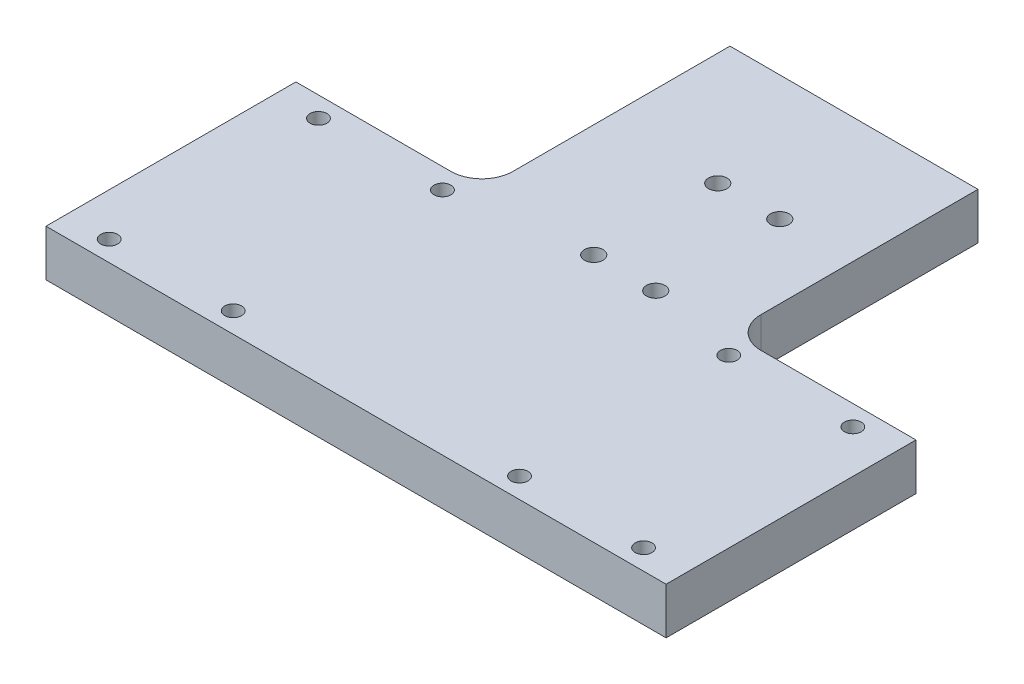
ISO-10303-21;
HEADER;
FILE_DESCRIPTION(('STEP AP214'),'2;1');
FILE_NAME('part.step','',(''),(''),'','','');
FILE_SCHEMA(('AUTOMOTIVE_DESIGN { 1 0 10303 214 1 1 1 1 }'));
ENDSEC;
DATA;
#1=APPLICATION_CONTEXT('core data for automotive mechanical design processes');
#2=APPLICATION_PROTOCOL_DEFINITION('international standard','automotive_design',2000,#1);
#3=PRODUCT_CONTEXT('',#1,'mechanical');
#4=PRODUCT('Part','Part','',(#3));
#5=PRODUCT_RELATED_PRODUCT_CATEGORY('part','',(#4));
#6=PRODUCT_DEFINITION_FORMATION('','',#4);
#7=PRODUCT_DEFINITION_CONTEXT('part definition',#1,'design');
#8=PRODUCT_DEFINITION('design','',#6,#7);
#9=PRODUCT_DEFINITION_SHAPE('','',#8);
#10=(LENGTH_UNIT() NAMED_UNIT(*) SI_UNIT(.MILLI.,.METRE.));
#11=(NAMED_UNIT(*) PLANE_ANGLE_UNIT() SI_UNIT($,.RADIAN.));
#12=(NAMED_UNIT(*) SI_UNIT($,.STERADIAN.) SOLID_ANGLE_UNIT());
#13=UNCERTAINTY_MEASURE_WITH_UNIT(LENGTH_MEASURE(1.E-05),#10,'distance_accuracy_value','');
#14=(GEOMETRIC_REPRESENTATION_CONTEXT(3) GLOBAL_UNCERTAINTY_ASSIGNED_CONTEXT((#13)) GLOBAL_UNIT_ASSIGNED_CONTEXT((#10,
#11,#12)) REPRESENTATION_CONTEXT('',''));
#15=CARTESIAN_POINT('',(0.,0.,0.));
#16=DIRECTION('',(0.,0.,1.));
#17=DIRECTION('',(1.,0.,0.));
#18=AXIS2_PLACEMENT_3D('',#15,#16,#17);
#19=CARTESIAN_POINT('',(-18.0297263185864,9.525,-60.566101755901));
#20=DIRECTION('',(1.,0.,0.));
#21=DIRECTION('',(0.,0.,-1.));
#22=AXIS2_PLACEMENT_3D('',#19,#20,#21);
#23=PLANE('',#22);
#24=DIRECTION('',(0.,0.,1.));
#25=VECTOR('',#24,1.);
#26=CARTESIAN_POINT('',(-18.0297263185864,0.,-60.566101755901));
#27=LINE('',#26,#25);
#28=CARTESIAN_POINT('',(-18.0297263185864,0.,-60.566101755901));
#29=VERTEX_POINT('',#28);
#30=CARTESIAN_POINT('',(-18.0297263185864,0.,-16.116101755901));
#31=VERTEX_POINT('',#30);
#32=EDGE_CURVE('E218',#29,#31,#27,.T.);
#33=ORIENTED_EDGE('',*,*,#32,.T.);
#34=DIRECTION('',(0.,-1.,0.));
#35=VECTOR('',#34,1.);
#36=CARTESIAN_POINT('',(-18.0297263185864,9.525,-16.116101755901));
#37=LINE('',#36,#35);
#38=CARTESIAN_POINT('',(-18.0297263185864,9.525,-16.116101755901));
#39=VERTEX_POINT('',#38);
#40=EDGE_CURVE('E273',#31,#39,#37,.F.);
#41=ORIENTED_EDGE('',*,*,#40,.T.);
#42=DIRECTION('',(0.,0.,1.));
#43=VECTOR('',#42,1.);
#44=CARTESIAN_POINT('',(-18.0297263185864,9.525,-60.566101755901));
#45=LINE('',#44,#43);
#46=CARTESIAN_POINT('',(-18.0297263185864,9.525,-60.566101755901));
#47=VERTEX_POINT('',#46);
#48=EDGE_CURVE('E219',#47,#39,#45,.T.);
#49=ORIENTED_EDGE('',*,*,#48,.F.);
#50=DIRECTION('',(0.,-1.,0.));
#51=VECTOR('',#50,1.);
#52=CARTESIAN_POINT('',(-18.0297263185864,9.525,-60.566101755901));
#53=LINE('',#52,#51);
#54=EDGE_CURVE('E237',#47,#29,#53,.T.);
#55=ORIENTED_EDGE('',*,*,#54,.T.);
#56=EDGE_LOOP('',(#33,#41,#49,#55));
#57=FACE_BOUND('',#56,.T.);
#58=ADVANCED_FACE('F35',(#57),#23,.F.);
#59=CARTESIAN_POINT('',(-56.1297263185865,9.525,-9.76610175590098));
#60=DIRECTION('',(0.,0.,1.));
#61=DIRECTION('',(1.,0.,0.));
#62=AXIS2_PLACEMENT_3D('',#59,#60,#61);
#63=PLANE('',#62);
#64=DIRECTION('',(-1.,0.,0.));
#65=VECTOR('',#64,1.);
#66=CARTESIAN_POINT('',(-56.1297263185865,9.525,-9.76610175590098));
#67=LINE('',#66,#65);
#68=CARTESIAN_POINT('',(-24.3797263185864,9.525,-9.76610175590098));
#69=VERTEX_POINT('',#68);
#70=CARTESIAN_POINT('',(-56.1297263185865,9.525,-9.76610175590098));
#71=VERTEX_POINT('',#70);
#72=EDGE_CURVE('E222',#69,#71,#67,.T.);
#73=ORIENTED_EDGE('',*,*,#72,.F.);
#74=DIRECTION('',(0.,-1.,0.));
#75=VECTOR('',#74,1.);
#76=CARTESIAN_POINT('',(-24.3797263185864,0.,-9.76610175590098));
#77=LINE('',#76,#75);
#78=CARTESIAN_POINT('',(-24.3797263185864,0.,-9.76610175590098));
#79=VERTEX_POINT('',#78);
#80=EDGE_CURVE('E270',#69,#79,#77,.T.);
#81=ORIENTED_EDGE('',*,*,#80,.T.);
#82=DIRECTION('',(-1.,0.,0.));
#83=VECTOR('',#82,1.);
#84=CARTESIAN_POINT('',(-56.1297263185865,0.,-9.76610175590098));
#85=LINE('',#84,#83);
#86=CARTESIAN_POINT('',(-56.1297263185865,0.,-9.76610175590098));
#87=VERTEX_POINT('',#86);
#88=EDGE_CURVE('E240',#79,#87,#85,.T.);
#89=ORIENTED_EDGE('',*,*,#88,.T.);
#90=DIRECTION('',(0.,-1.,0.));
#91=VECTOR('',#90,1.);
#92=CARTESIAN_POINT('',(-56.1297263185865,9.525,-9.76610175590098));
#93=LINE('',#92,#91);
#94=EDGE_CURVE('E267',#71,#87,#93,.T.);
#95=ORIENTED_EDGE('',*,*,#94,.F.);
#96=EDGE_LOOP('',(#73,#81,#89,#95));
#97=FACE_BOUND('',#96,.T.);
#98=ADVANCED_FACE('F292',(#97),#63,.F.);
#99=CARTESIAN_POINT('',(-56.1297263185865,9.525,-9.76610175590098));
#100=DIRECTION('',(1.,0.,0.));
#101=DIRECTION('',(0.,0.,-1.));
#102=AXIS2_PLACEMENT_3D('',#99,#100,#101);
#103=PLANE('',#102);
#104=DIRECTION('',(0.,0.,1.));
#105=VECTOR('',#104,1.);
#106=CARTESIAN_POINT('',(-56.1297263185865,0.,-9.76610175590098));
#107=LINE('',#106,#105);
#108=CARTESIAN_POINT('',(-56.1297263185865,0.,41.414898244099));
#109=VERTEX_POINT('',#108);
#110=EDGE_CURVE('E242',#87,#109,#107,.T.);
#111=ORIENTED_EDGE('',*,*,#110,.T.);
#112=DIRECTION('',(0.,-1.,0.));
#113=VECTOR('',#112,1.);
#114=CARTESIAN_POINT('',(-56.1297263185865,9.525,41.414898244099));
#115=LINE('',#114,#113);
#116=CARTESIAN_POINT('',(-56.1297263185865,9.525,41.414898244099));
#117=VERTEX_POINT('',#116);
#118=EDGE_CURVE('E264',#117,#109,#115,.T.);
#119=ORIENTED_EDGE('',*,*,#118,.F.);
#120=DIRECTION('',(0.,0.,1.));
#121=VECTOR('',#120,1.);
#122=CARTESIAN_POINT('',(-56.1297263185865,9.525,-9.76610175590098));
#123=LINE('',#122,#121);
#124=EDGE_CURVE('E225',#71,#117,#123,.T.);
#125=ORIENTED_EDGE('',*,*,#124,.F.);
#126=ORIENTED_EDGE('',*,*,#94,.T.);
#127=EDGE_LOOP('',(#111,#119,#125,#126));
#128=FACE_BOUND('',#127,.T.);
#129=ADVANCED_FACE('F325',(#128),#103,.F.);
#130=CARTESIAN_POINT('',(70.8702736814136,9.525,41.414898244099));
#131=DIRECTION('',(0.,0.,-1.));
#132=DIRECTION('',(-1.,0.,0.));
#133=AXIS2_PLACEMENT_3D('',#130,#131,#132);
#134=PLANE('',#133);
#135=DIRECTION('',(1.,0.,0.));
#136=VECTOR('',#135,1.);
#137=CARTESIAN_POINT('',(70.8702736814136,0.,41.414898244099));
#138=LINE('',#137,#136);
#139=CARTESIAN_POINT('',(70.8702736814136,0.,41.414898244099));
#140=VERTEX_POINT('',#139);
#141=EDGE_CURVE('E244',#109,#140,#138,.T.);
#142=ORIENTED_EDGE('',*,*,#141,.T.);
#143=DIRECTION('',(0.,-1.,0.));
#144=VECTOR('',#143,1.);
#145=CARTESIAN_POINT('',(70.8702736814136,9.525,41.414898244099));
#146=LINE('',#145,#144);
#147=CARTESIAN_POINT('',(70.8702736814136,9.525,41.414898244099));
#148=VERTEX_POINT('',#147);
#149=EDGE_CURVE('E261',#148,#140,#146,.T.);
#150=ORIENTED_EDGE('',*,*,#149,.F.);
#151=DIRECTION('',(1.,0.,0.));
#152=VECTOR('',#151,1.);
#153=CARTESIAN_POINT('',(70.8702736814136,9.525,41.414898244099));
#154=LINE('',#153,#152);
#155=EDGE_CURVE('E227',#117,#148,#154,.T.);
#156=ORIENTED_EDGE('',*,*,#155,.F.);
#157=ORIENTED_EDGE('',*,*,#118,.T.);
#158=EDGE_LOOP('',(#142,#150,#156,#157));
#159=FACE_BOUND('',#158,.T.);
#160=ADVANCED_FACE('F322',(#159),#134,.F.);
#161=CARTESIAN_POINT('',(70.8702736814136,9.525,-9.76610175590098));
#162=DIRECTION('',(-1.,0.,0.));
#163=DIRECTION('',(0.,0.,1.));
#164=AXIS2_PLACEMENT_3D('',#161,#162,#163);
#165=PLANE('',#164);
#166=DIRECTION('',(0.,0.,-1.));
#167=VECTOR('',#166,1.);
#168=CARTESIAN_POINT('',(70.8702736814136,0.,-9.76610175590098));
#169=LINE('',#168,#167);
#170=CARTESIAN_POINT('',(70.8702736814136,0.,-9.76610175590098));
#171=VERTEX_POINT('',#170);
#172=EDGE_CURVE('E246',#140,#171,#169,.T.);
#173=ORIENTED_EDGE('',*,*,#172,.T.);
#174=DIRECTION('',(0.,-1.,0.));
#175=VECTOR('',#174,1.);
#176=CARTESIAN_POINT('',(70.8702736814136,9.525,-9.76610175590098));
#177=LINE('',#176,#175);
#178=CARTESIAN_POINT('',(70.8702736814136,9.525,-9.76610175590098));
#179=VERTEX_POINT('',#178);
#180=EDGE_CURVE('E258',#179,#171,#177,.T.);
#181=ORIENTED_EDGE('',*,*,#180,.F.);
#182=DIRECTION('',(0.,0.,-1.));
#183=VECTOR('',#182,1.);
#184=CARTESIAN_POINT('',(70.8702736814136,9.525,-9.76610175590098));
#185=LINE('',#184,#183);
#186=EDGE_CURVE('E229',#148,#179,#185,.T.);
#187=ORIENTED_EDGE('',*,*,#186,.F.);
#188=ORIENTED_EDGE('',*,*,#149,.T.);
#189=EDGE_LOOP('',(#173,#181,#187,#188));
#190=FACE_BOUND('',#189,.T.);
#191=ADVANCED_FACE('F318',(#190),#165,.F.);
#192=CARTESIAN_POINT('',(32.7702736814136,9.525,-9.76610175590098));
#193=DIRECTION('',(0.,0.,1.));
#194=DIRECTION('',(1.,0.,0.));
#195=AXIS2_PLACEMENT_3D('',#192,#193,#194);
#196=PLANE('',#195);
#197=DIRECTION('',(-1.,0.,0.));
#198=VECTOR('',#197,1.);
#199=CARTESIAN_POINT('',(32.7702736814136,0.,-9.76610175590098));
#200=LINE('',#199,#198);
#201=CARTESIAN_POINT('',(39.1202736814136,0.,-9.76610175590098));
#202=VERTEX_POINT('',#201);
#203=EDGE_CURVE('E248',#171,#202,#200,.T.);
#204=ORIENTED_EDGE('',*,*,#203,.T.);
#205=DIRECTION('',(0.,-1.,0.));
#206=VECTOR('',#205,1.);
#207=CARTESIAN_POINT('',(39.1202736814136,9.525,-9.76610175590098));
#208=LINE('',#207,#206);
#209=CARTESIAN_POINT('',(39.1202736814136,9.525,-9.76610175590098));
#210=VERTEX_POINT('',#209);
#211=EDGE_CURVE('E50',#202,#210,#208,.F.);
#212=ORIENTED_EDGE('',*,*,#211,.T.);
#213=DIRECTION('',(-1.,0.,0.));
#214=VECTOR('',#213,1.);
#215=CARTESIAN_POINT('',(32.7702736814136,9.525,-9.76610175590098));
#216=LINE('',#215,#214);
#217=EDGE_CURVE('E231',#179,#210,#216,.T.);
#218=ORIENTED_EDGE('',*,*,#217,.F.);
#219=ORIENTED_EDGE('',*,*,#180,.T.);
#220=EDGE_LOOP('',(#204,#212,#218,#219));
#221=FACE_BOUND('',#220,.T.);
#222=ADVANCED_FACE('F314',(#221),#196,.F.);
#223=CARTESIAN_POINT('',(32.7702736814136,9.525,-60.566101755901));
#224=DIRECTION('',(-1.,0.,0.));
#225=DIRECTION('',(0.,0.,1.));
#226=AXIS2_PLACEMENT_3D('',#223,#224,#225);
#227=PLANE('',#226);
#228=DIRECTION('',(0.,0.,-1.));
#229=VECTOR('',#228,1.);
#230=CARTESIAN_POINT('',(32.7702736814136,9.525,-60.566101755901));
#231=LINE('',#230,#229);
#232=CARTESIAN_POINT('',(32.7702736814136,9.525,-16.116101755901));
#233=VERTEX_POINT('',#232);
#234=CARTESIAN_POINT('',(32.7702736814136,9.525,-60.566101755901));
#235=VERTEX_POINT('',#234);
#236=EDGE_CURVE('E233',#233,#235,#231,.T.);
#237=ORIENTED_EDGE('',*,*,#236,.F.);
#238=DIRECTION('',(0.,-1.,0.));
#239=VECTOR('',#238,1.);
#240=CARTESIAN_POINT('',(32.7702736814136,0.,-16.116101755901));
#241=LINE('',#240,#239);
#242=CARTESIAN_POINT('',(32.7702736814136,0.,-16.116101755901));
#243=VERTEX_POINT('',#242);
#244=EDGE_CURVE('E275',#233,#243,#241,.T.);
#245=ORIENTED_EDGE('',*,*,#244,.T.);
#246=DIRECTION('',(0.,0.,-1.));
#247=VECTOR('',#246,1.);
#248=CARTESIAN_POINT('',(32.7702736814136,0.,-60.566101755901));
#249=LINE('',#248,#247);
#250=CARTESIAN_POINT('',(32.7702736814136,0.,-60.566101755901));
#251=VERTEX_POINT('',#250);
#252=EDGE_CURVE('E250',#243,#251,#249,.T.);
#253=ORIENTED_EDGE('',*,*,#252,.T.);
#254=DIRECTION('',(0.,-1.,0.));
#255=VECTOR('',#254,1.);
#256=CARTESIAN_POINT('',(32.7702736814136,9.525,-60.566101755901));
#257=LINE('',#256,#255);
#258=EDGE_CURVE('E255',#235,#251,#257,.T.);
#259=ORIENTED_EDGE('',*,*,#258,.F.);
#260=EDGE_LOOP('',(#237,#245,#253,#259));
#261=FACE_BOUND('',#260,.T.);
#262=ADVANCED_FACE('F308',(#261),#227,.F.);
#263=CARTESIAN_POINT('',(-18.0297263185864,9.525,-60.566101755901));
#264=DIRECTION('',(0.,0.,1.));
#265=DIRECTION('',(1.,0.,0.));
#266=AXIS2_PLACEMENT_3D('',#263,#264,#265);
#267=PLANE('',#266);
#268=CARTESIAN_POINT('',(-8.50472631858644,4.7625,-60.566101755901));
#269=DIRECTION('',(0.,0.,-1.));
#270=DIRECTION('',(-1.,0.,0.));
#271=AXIS2_PLACEMENT_3D('',#268,#269,#270);
#272=CIRCLE('',#271,2.5527);
#273=CARTESIAN_POINT('',(-11.0574263185864,4.7625,-60.566101755901));
#274=VERTEX_POINT('',#273);
#275=EDGE_CURVE('E130',#274,#274,#272,.T.);
#276=ORIENTED_EDGE('',*,*,#275,.F.);
#277=EDGE_LOOP('',(#276));
#278=FACE_BOUND('',#277,.T.);
#279=CARTESIAN_POINT('',(7.37027368141356,4.7625,-60.566101755901));
#280=DIRECTION('',(0.,0.,-1.));
#281=DIRECTION('',(-1.,0.,0.));
#282=AXIS2_PLACEMENT_3D('',#279,#280,#281);
#283=CIRCLE('',#282,2.5527);
#284=CARTESIAN_POINT('',(4.81757368141356,4.7625,-60.566101755901));
#285=VERTEX_POINT('',#284);
#286=EDGE_CURVE('E129',#285,#285,#283,.T.);
#287=ORIENTED_EDGE('',*,*,#286,.F.);
#288=EDGE_LOOP('',(#287));
#289=FACE_BOUND('',#288,.T.);
#290=CARTESIAN_POINT('',(23.2452736814136,4.7625,-60.566101755901));
#291=DIRECTION('',(0.,0.,-1.));
#292=DIRECTION('',(-1.,0.,0.));
#293=AXIS2_PLACEMENT_3D('',#290,#291,#292);
#294=CIRCLE('',#293,2.5527);
#295=CARTESIAN_POINT('',(20.6925736814136,4.7625,-60.566101755901));
#296=VERTEX_POINT('',#295);
#297=EDGE_CURVE('E140',#296,#296,#294,.T.);
#298=ORIENTED_EDGE('',*,*,#297,.F.);
#299=EDGE_LOOP('',(#298));
#300=FACE_BOUND('',#299,.T.);
#301=DIRECTION('',(-1.,0.,0.));
#302=VECTOR('',#301,1.);
#303=CARTESIAN_POINT('',(-18.0297263185864,0.,-60.566101755901));
#304=LINE('',#303,#302);
#305=EDGE_CURVE('E223',#251,#29,#304,.T.);
#306=ORIENTED_EDGE('',*,*,#305,.T.);
#307=ORIENTED_EDGE('',*,*,#54,.F.);
#308=DIRECTION('',(-1.,0.,0.));
#309=VECTOR('',#308,1.);
#310=CARTESIAN_POINT('',(-18.0297263185864,9.525,-60.566101755901));
#311=LINE('',#310,#309);
#312=EDGE_CURVE('E235',#235,#47,#311,.T.);
#313=ORIENTED_EDGE('',*,*,#312,.F.);
#314=ORIENTED_EDGE('',*,*,#258,.T.);
#315=EDGE_LOOP('',(#306,#307,#313,#314));
#316=FACE_BOUND('',#315,.T.);
#317=ADVANCED_FACE('F304',(#278,#289,#300,#316),#267,.F.);
#318=CARTESIAN_POINT('',(0.,9.525,0.));
#319=DIRECTION('',(0.,1.,0.));
#320=DIRECTION('',(0.,0.,1.));
#321=AXIS2_PLACEMENT_3D('',#318,#319,#320);
#322=PLANE('',#321);
#323=CARTESIAN_POINT('',(5.05887368141354,9.525,-34.975601755901));
#324=DIRECTION('',(0.,1.,0.));
#325=DIRECTION('',(0.,0.,1.));
#326=AXIS2_PLACEMENT_3D('',#323,#324,#325);
#327=CIRCLE('',#326,1.89864999999999);
#328=CARTESIAN_POINT('',(5.05887368141354,9.525,-33.076951755901));
#329=VERTEX_POINT('',#328);
#330=EDGE_CURVE('E146',#329,#329,#327,.T.);
#331=ORIENTED_EDGE('',*,*,#330,.F.);
#332=EDGE_LOOP('',(#331));
#333=FACE_BOUND('',#332,.T.);
#334=CARTESIAN_POINT('',(17.7588736814135,9.525,-34.975601755901));
#335=DIRECTION('',(0.,1.,0.));
#336=DIRECTION('',(0.,0.,1.));
#337=AXIS2_PLACEMENT_3D('',#334,#335,#336);
#338=CIRCLE('',#337,1.89864999999999);
#339=CARTESIAN_POINT('',(17.7588736814135,9.525,-33.076951755901));
#340=VERTEX_POINT('',#339);
#341=EDGE_CURVE('E152',#340,#340,#338,.T.);
#342=ORIENTED_EDGE('',*,*,#341,.F.);
#343=EDGE_LOOP('',(#342));
#344=FACE_BOUND('',#343,.T.);
#345=CARTESIAN_POINT('',(5.05887368141354,9.525,-9.57560175590098));
#346=DIRECTION('',(0.,1.,0.));
#347=DIRECTION('',(0.,0.,1.));
#348=AXIS2_PLACEMENT_3D('',#345,#346,#347);
#349=CIRCLE('',#348,1.89864999999999);
#350=CARTESIAN_POINT('',(5.05887368141354,9.525,-7.67695175590099));
#351=VERTEX_POINT('',#350);
#352=EDGE_CURVE('E158',#351,#351,#349,.T.);
#353=ORIENTED_EDGE('',*,*,#352,.F.);
#354=EDGE_LOOP('',(#353));
#355=FACE_BOUND('',#354,.T.);
#356=CARTESIAN_POINT('',(17.7588736814135,9.525,-9.57560175590096));
#357=DIRECTION('',(0.,1.,0.));
#358=DIRECTION('',(0.,0.,1.));
#359=AXIS2_PLACEMENT_3D('',#356,#357,#358);
#360=CIRCLE('',#359,1.89864999999999);
#361=CARTESIAN_POINT('',(17.7588736814135,9.525,-7.67695175590098));
#362=VERTEX_POINT('',#361);
#363=EDGE_CURVE('E164',#362,#362,#360,.T.);
#364=ORIENTED_EDGE('',*,*,#363,.F.);
#365=EDGE_LOOP('',(#364));
#366=FACE_BOUND('',#365,.T.);
#367=CARTESIAN_POINT('',(-47.3540263185865,9.525,-5.60685175590098));
#368=DIRECTION('',(0.,1.,0.));
#369=DIRECTION('',(0.,0.,1.));
#370=AXIS2_PLACEMENT_3D('',#367,#368,#369);
#371=CIRCLE('',#370,1.72719999999998);
#372=CARTESIAN_POINT('',(-47.3540263185865,9.525,-3.879651755901));
#373=VERTEX_POINT('',#372);
#374=EDGE_CURVE('E170',#373,#373,#371,.T.);
#375=ORIENTED_EDGE('',*,*,#374,.F.);
#376=EDGE_LOOP('',(#375));
#377=FACE_BOUND('',#376,.T.);
#378=CARTESIAN_POINT('',(-47.3540263185865,9.525,37.255648244099));
#379=DIRECTION('',(0.,1.,0.));
#380=DIRECTION('',(0.,0.,1.));
#381=AXIS2_PLACEMENT_3D('',#378,#379,#380);
#382=CIRCLE('',#381,1.72719999999998);
#383=CARTESIAN_POINT('',(-47.3540263185865,9.525,38.982848244099));
#384=VERTEX_POINT('',#383);
#385=EDGE_CURVE('E176',#384,#384,#382,.T.);
#386=ORIENTED_EDGE('',*,*,#385,.F.);
#387=EDGE_LOOP('',(#386));
#388=FACE_BOUND('',#387,.T.);
#389=CARTESIAN_POINT('',(-21.9540263185865,9.525,37.255648244099));
#390=DIRECTION('',(0.,1.,0.));
#391=DIRECTION('',(0.,0.,1.));
#392=AXIS2_PLACEMENT_3D('',#389,#390,#391);
#393=CIRCLE('',#392,1.72719999999999);
#394=CARTESIAN_POINT('',(-21.9540263185865,9.525,38.982848244099));
#395=VERTEX_POINT('',#394);
#396=EDGE_CURVE('E182',#395,#395,#393,.T.);
#397=ORIENTED_EDGE('',*,*,#396,.F.);
#398=EDGE_LOOP('',(#397));
#399=FACE_BOUND('',#398,.T.);
#400=CARTESIAN_POINT('',(-21.9540263185865,9.525,-5.60685175590098));
#401=DIRECTION('',(0.,1.,0.));
#402=DIRECTION('',(0.,0.,1.));
#403=AXIS2_PLACEMENT_3D('',#400,#401,#402);
#404=CIRCLE('',#403,1.72719999999999);
#405=CARTESIAN_POINT('',(-21.9540263185865,9.525,-3.879651755901));
#406=VERTEX_POINT('',#405);
#407=EDGE_CURVE('E188',#406,#406,#404,.T.);
#408=ORIENTED_EDGE('',*,*,#407,.F.);
#409=EDGE_LOOP('',(#408));
#410=FACE_BOUND('',#409,.T.);
#411=CARTESIAN_POINT('',(62.0945736814136,9.525,-5.60685175590097));
#412=DIRECTION('',(0.,1.,0.));
#413=DIRECTION('',(0.,0.,1.));
#414=AXIS2_PLACEMENT_3D('',#411,#412,#413);
#415=CIRCLE('',#414,1.72719999999998);
#416=CARTESIAN_POINT('',(62.0945736814136,9.525,-3.87965175590099));
#417=VERTEX_POINT('',#416);
#418=EDGE_CURVE('E194',#417,#417,#415,.T.);
#419=ORIENTED_EDGE('',*,*,#418,.F.);
#420=EDGE_LOOP('',(#419));
#421=FACE_BOUND('',#420,.T.);
#422=CARTESIAN_POINT('',(62.0945736814136,9.525,37.255648244099));
#423=DIRECTION('',(0.,1.,0.));
#424=DIRECTION('',(0.,0.,1.));
#425=AXIS2_PLACEMENT_3D('',#422,#423,#424);
#426=CIRCLE('',#425,1.72719999999998);
#427=CARTESIAN_POINT('',(62.0945736814136,9.525,38.982848244099));
#428=VERTEX_POINT('',#427);
#429=EDGE_CURVE('E200',#428,#428,#426,.T.);
#430=ORIENTED_EDGE('',*,*,#429,.F.);
#431=EDGE_LOOP('',(#430));
#432=FACE_BOUND('',#431,.T.);
#433=CARTESIAN_POINT('',(36.6945736814136,9.525,37.255648244099));
#434=DIRECTION('',(0.,1.,0.));
#435=DIRECTION('',(0.,0.,1.));
#436=AXIS2_PLACEMENT_3D('',#433,#434,#435);
#437=CIRCLE('',#436,1.72719999999998);
#438=CARTESIAN_POINT('',(36.6945736814136,9.525,38.982848244099));
#439=VERTEX_POINT('',#438);
#440=EDGE_CURVE('E206',#439,#439,#437,.T.);
#441=ORIENTED_EDGE('',*,*,#440,.F.);
#442=EDGE_LOOP('',(#441));
#443=FACE_BOUND('',#442,.T.);
#444=CARTESIAN_POINT('',(36.6945736814136,9.525,-5.60685175590099));
#445=DIRECTION('',(0.,1.,0.));
#446=DIRECTION('',(0.,0.,1.));
#447=AXIS2_PLACEMENT_3D('',#444,#445,#446);
#448=CIRCLE('',#447,1.72719999999998);
#449=CARTESIAN_POINT('',(36.6945736814136,9.525,-3.87965175590101));
#450=VERTEX_POINT('',#449);
#451=EDGE_CURVE('E212',#450,#450,#448,.T.);
#452=ORIENTED_EDGE('',*,*,#451,.F.);
#453=EDGE_LOOP('',(#452));
#454=FACE_BOUND('',#453,.T.);
#455=ORIENTED_EDGE('',*,*,#48,.T.);
#456=CARTESIAN_POINT('',(-24.3797263185864,9.525,-16.116101755901));
#457=DIRECTION('',(0.,1.,0.));
#458=DIRECTION('',(0.,0.,1.));
#459=AXIS2_PLACEMENT_3D('',#456,#457,#458);
#460=CIRCLE('',#459,6.35);
#461=EDGE_CURVE('E281',#39,#69,#460,.F.);
#462=ORIENTED_EDGE('',*,*,#461,.T.);
#463=ORIENTED_EDGE('',*,*,#72,.T.);
#464=ORIENTED_EDGE('',*,*,#124,.T.);
#465=ORIENTED_EDGE('',*,*,#155,.T.);
#466=ORIENTED_EDGE('',*,*,#186,.T.);
#467=ORIENTED_EDGE('',*,*,#217,.T.);
#468=CARTESIAN_POINT('',(39.1202736814136,9.525,-16.116101755901));
#469=DIRECTION('',(0.,1.,0.));
#470=DIRECTION('',(0.,0.,1.));
#471=AXIS2_PLACEMENT_3D('',#468,#469,#470);
#472=CIRCLE('',#471,6.35);
#473=EDGE_CURVE('E11',#210,#233,#472,.F.);
#474=ORIENTED_EDGE('',*,*,#473,.T.);
#475=ORIENTED_EDGE('',*,*,#236,.T.);
#476=ORIENTED_EDGE('',*,*,#312,.T.);
#477=EDGE_LOOP('',(#455,#462,#463,#464,#465,#466,#467,#474,#475,#476));
#478=FACE_BOUND('',#477,.T.);
#479=ADVANCED_FACE('F285',(#333,#344,#355,#366,#377,#388,#399,#410,#421,#432,#443,#454,#478),
#322,.T.);
#480=CARTESIAN_POINT('',(0.,0.,0.));
#481=DIRECTION('',(0.,1.,0.));
#482=DIRECTION('',(0.,0.,1.));
#483=AXIS2_PLACEMENT_3D('',#480,#481,#482);
#484=PLANE('',#483);
#485=CARTESIAN_POINT('',(5.05887368141354,0.,-34.975601755901));
#486=DIRECTION('',(0.,1.,0.));
#487=DIRECTION('',(0.,0.,1.));
#488=AXIS2_PLACEMENT_3D('',#485,#486,#487);
#489=CIRCLE('',#488,1.89865);
#490=CARTESIAN_POINT('',(5.05887368141354,0.,-33.076951755901));
#491=VERTEX_POINT('',#490);
#492=EDGE_CURVE('E149',#491,#491,#489,.T.);
#493=ORIENTED_EDGE('',*,*,#492,.T.);
#494=EDGE_LOOP('',(#493));
#495=FACE_BOUND('',#494,.T.);
#496=CARTESIAN_POINT('',(17.7588736814135,0.,-34.975601755901));
#497=DIRECTION('',(0.,1.,0.));
#498=DIRECTION('',(0.,0.,1.));
#499=AXIS2_PLACEMENT_3D('',#496,#497,#498);
#500=CIRCLE('',#499,1.89865);
#501=CARTESIAN_POINT('',(17.7588736814135,0.,-33.076951755901));
#502=VERTEX_POINT('',#501);
#503=EDGE_CURVE('E155',#502,#502,#500,.T.);
#504=ORIENTED_EDGE('',*,*,#503,.T.);
#505=EDGE_LOOP('',(#504));
#506=FACE_BOUND('',#505,.T.);
#507=CARTESIAN_POINT('',(5.05887368141354,0.,-9.57560175590098));
#508=DIRECTION('',(0.,1.,0.));
#509=DIRECTION('',(0.,0.,1.));
#510=AXIS2_PLACEMENT_3D('',#507,#508,#509);
#511=CIRCLE('',#510,1.89865);
#512=CARTESIAN_POINT('',(5.05887368141354,0.,-7.67695175590098));
#513=VERTEX_POINT('',#512);
#514=EDGE_CURVE('E161',#513,#513,#511,.T.);
#515=ORIENTED_EDGE('',*,*,#514,.T.);
#516=EDGE_LOOP('',(#515));
#517=FACE_BOUND('',#516,.T.);
#518=CARTESIAN_POINT('',(17.7588736814135,0.,-9.57560175590096));
#519=DIRECTION('',(0.,1.,0.));
#520=DIRECTION('',(0.,0.,1.));
#521=AXIS2_PLACEMENT_3D('',#518,#519,#520);
#522=CIRCLE('',#521,1.89865);
#523=CARTESIAN_POINT('',(17.7588736814135,0.,-7.67695175590096));
#524=VERTEX_POINT('',#523);
#525=EDGE_CURVE('E167',#524,#524,#522,.T.);
#526=ORIENTED_EDGE('',*,*,#525,.T.);
#527=EDGE_LOOP('',(#526));
#528=FACE_BOUND('',#527,.T.);
#529=CARTESIAN_POINT('',(-47.3540263185865,0.,-5.60685175590098));
#530=DIRECTION('',(0.,1.,0.));
#531=DIRECTION('',(0.,0.,1.));
#532=AXIS2_PLACEMENT_3D('',#529,#530,#531);
#533=CIRCLE('',#532,1.7272);
#534=CARTESIAN_POINT('',(-47.3540263185865,0.,-3.87965175590098));
#535=VERTEX_POINT('',#534);
#536=EDGE_CURVE('E173',#535,#535,#533,.T.);
#537=ORIENTED_EDGE('',*,*,#536,.T.);
#538=EDGE_LOOP('',(#537));
#539=FACE_BOUND('',#538,.T.);
#540=CARTESIAN_POINT('',(-47.3540263185865,0.,37.255648244099));
#541=DIRECTION('',(0.,1.,0.));
#542=DIRECTION('',(0.,0.,1.));
#543=AXIS2_PLACEMENT_3D('',#540,#541,#542);
#544=CIRCLE('',#543,1.7272);
#545=CARTESIAN_POINT('',(-47.3540263185865,0.,38.982848244099));
#546=VERTEX_POINT('',#545);
#547=EDGE_CURVE('E179',#546,#546,#544,.T.);
#548=ORIENTED_EDGE('',*,*,#547,.T.);
#549=EDGE_LOOP('',(#548));
#550=FACE_BOUND('',#549,.T.);
#551=CARTESIAN_POINT('',(-21.9540263185865,0.,37.255648244099));
#552=DIRECTION('',(0.,1.,0.));
#553=DIRECTION('',(0.,0.,1.));
#554=AXIS2_PLACEMENT_3D('',#551,#552,#553);
#555=CIRCLE('',#554,1.7272);
#556=CARTESIAN_POINT('',(-21.9540263185865,0.,38.982848244099));
#557=VERTEX_POINT('',#556);
#558=EDGE_CURVE('E185',#557,#557,#555,.T.);
#559=ORIENTED_EDGE('',*,*,#558,.T.);
#560=EDGE_LOOP('',(#559));
#561=FACE_BOUND('',#560,.T.);
#562=CARTESIAN_POINT('',(-21.9540263185865,0.,-5.60685175590098));
#563=DIRECTION('',(0.,1.,0.));
#564=DIRECTION('',(0.,0.,1.));
#565=AXIS2_PLACEMENT_3D('',#562,#563,#564);
#566=CIRCLE('',#565,1.7272);
#567=CARTESIAN_POINT('',(-21.9540263185865,0.,-3.87965175590099));
#568=VERTEX_POINT('',#567);
#569=EDGE_CURVE('E191',#568,#568,#566,.T.);
#570=ORIENTED_EDGE('',*,*,#569,.T.);
#571=EDGE_LOOP('',(#570));
#572=FACE_BOUND('',#571,.T.);
#573=CARTESIAN_POINT('',(62.0945736814136,0.,-5.60685175590097));
#574=DIRECTION('',(0.,1.,0.));
#575=DIRECTION('',(0.,0.,1.));
#576=AXIS2_PLACEMENT_3D('',#573,#574,#575);
#577=CIRCLE('',#576,1.7272);
#578=CARTESIAN_POINT('',(62.0945736814136,0.,-3.87965175590097));
#579=VERTEX_POINT('',#578);
#580=EDGE_CURVE('E197',#579,#579,#577,.T.);
#581=ORIENTED_EDGE('',*,*,#580,.T.);
#582=EDGE_LOOP('',(#581));
#583=FACE_BOUND('',#582,.T.);
#584=CARTESIAN_POINT('',(62.0945736814136,0.,37.255648244099));
#585=DIRECTION('',(0.,1.,0.));
#586=DIRECTION('',(0.,0.,1.));
#587=AXIS2_PLACEMENT_3D('',#584,#585,#586);
#588=CIRCLE('',#587,1.7272);
#589=CARTESIAN_POINT('',(62.0945736814136,0.,38.982848244099));
#590=VERTEX_POINT('',#589);
#591=EDGE_CURVE('E203',#590,#590,#588,.T.);
#592=ORIENTED_EDGE('',*,*,#591,.T.);
#593=EDGE_LOOP('',(#592));
#594=FACE_BOUND('',#593,.T.);
#595=CARTESIAN_POINT('',(36.6945736814136,0.,37.255648244099));
#596=DIRECTION('',(0.,1.,0.));
#597=DIRECTION('',(0.,0.,1.));
#598=AXIS2_PLACEMENT_3D('',#595,#596,#597);
#599=CIRCLE('',#598,1.7272);
#600=CARTESIAN_POINT('',(36.6945736814136,0.,38.982848244099));
#601=VERTEX_POINT('',#600);
#602=EDGE_CURVE('E209',#601,#601,#599,.T.);
#603=ORIENTED_EDGE('',*,*,#602,.T.);
#604=EDGE_LOOP('',(#603));
#605=FACE_BOUND('',#604,.T.);
#606=CARTESIAN_POINT('',(36.6945736814136,0.,-5.60685175590099));
#607=DIRECTION('',(0.,1.,0.));
#608=DIRECTION('',(0.,0.,1.));
#609=AXIS2_PLACEMENT_3D('',#606,#607,#608);
#610=CIRCLE('',#609,1.7272);
#611=CARTESIAN_POINT('',(36.6945736814136,0.,-3.87965175590099));
#612=VERTEX_POINT('',#611);
#613=EDGE_CURVE('E215',#612,#612,#610,.T.);
#614=ORIENTED_EDGE('',*,*,#613,.T.);
#615=EDGE_LOOP('',(#614));
#616=FACE_BOUND('',#615,.T.);
#617=ORIENTED_EDGE('',*,*,#32,.F.);
#618=ORIENTED_EDGE('',*,*,#305,.F.);
#619=ORIENTED_EDGE('',*,*,#252,.F.);
#620=CARTESIAN_POINT('',(39.1202736814136,0.,-16.116101755901));
#621=DIRECTION('',(0.,1.,0.));
#622=DIRECTION('',(0.,0.,1.));
#623=AXIS2_PLACEMENT_3D('',#620,#621,#622);
#624=CIRCLE('',#623,6.35);
#625=EDGE_CURVE('E43',#243,#202,#624,.T.);
#626=ORIENTED_EDGE('',*,*,#625,.T.);
#627=ORIENTED_EDGE('',*,*,#203,.F.);
#628=ORIENTED_EDGE('',*,*,#172,.F.);
#629=ORIENTED_EDGE('',*,*,#141,.F.);
#630=ORIENTED_EDGE('',*,*,#110,.F.);
#631=ORIENTED_EDGE('',*,*,#88,.F.);
#632=CARTESIAN_POINT('',(-24.3797263185864,0.,-16.116101755901));
#633=DIRECTION('',(0.,1.,0.));
#634=DIRECTION('',(0.,0.,1.));
#635=AXIS2_PLACEMENT_3D('',#632,#633,#634);
#636=CIRCLE('',#635,6.35);
#637=EDGE_CURVE('E279',#79,#31,#636,.T.);
#638=ORIENTED_EDGE('',*,*,#637,.T.);
#639=EDGE_LOOP('',(#617,#618,#619,#626,#627,#628,#629,#630,#631,#638));
#640=FACE_BOUND('',#639,.T.);
#641=ADVANCED_FACE('F297',(#495,#506,#517,#528,#539,#550,#561,#572,#583,#594,#605,#616,#640),
#484,.F.);
#642=CARTESIAN_POINT('',(36.6945736814136,9.525,-5.60685175590099));
#643=DIRECTION('',(0.,1.,0.));
#644=DIRECTION('',(0.,0.,1.));
#645=AXIS2_PLACEMENT_3D('',#642,#643,#644);
#646=CYLINDRICAL_SURFACE('',#645,1.72719999999999);
#647=ORIENTED_EDGE('',*,*,#613,.F.);
#648=EDGE_LOOP('',(#647));
#649=FACE_BOUND('',#648,.T.);
#650=ORIENTED_EDGE('',*,*,#451,.T.);
#651=EDGE_LOOP('',(#650));
#652=FACE_BOUND('',#651,.T.);
#653=ADVANCED_FACE('F408',(#649,#652),#646,.F.);
#654=CARTESIAN_POINT('',(36.6945736814136,9.525,37.255648244099));
#655=DIRECTION('',(0.,1.,0.));
#656=DIRECTION('',(0.,0.,1.));
#657=AXIS2_PLACEMENT_3D('',#654,#655,#656);
#658=CYLINDRICAL_SURFACE('',#657,1.72719999999999);
#659=ORIENTED_EDGE('',*,*,#602,.F.);
#660=EDGE_LOOP('',(#659));
#661=FACE_BOUND('',#660,.T.);
#662=ORIENTED_EDGE('',*,*,#440,.T.);
#663=EDGE_LOOP('',(#662));
#664=FACE_BOUND('',#663,.T.);
#665=ADVANCED_FACE('F404',(#661,#664),#658,.F.);
#666=CARTESIAN_POINT('',(62.0945736814136,9.525,37.255648244099));
#667=DIRECTION('',(0.,1.,0.));
#668=DIRECTION('',(0.,0.,1.));
#669=AXIS2_PLACEMENT_3D('',#666,#667,#668);
#670=CYLINDRICAL_SURFACE('',#669,1.72719999999999);
#671=ORIENTED_EDGE('',*,*,#591,.F.);
#672=EDGE_LOOP('',(#671));
#673=FACE_BOUND('',#672,.T.);
#674=ORIENTED_EDGE('',*,*,#429,.T.);
#675=EDGE_LOOP('',(#674));
#676=FACE_BOUND('',#675,.T.);
#677=ADVANCED_FACE('F400',(#673,#676),#670,.F.);
#678=CARTESIAN_POINT('',(62.0945736814136,9.525,-5.60685175590097));
#679=DIRECTION('',(0.,1.,0.));
#680=DIRECTION('',(0.,0.,1.));
#681=AXIS2_PLACEMENT_3D('',#678,#679,#680);
#682=CYLINDRICAL_SURFACE('',#681,1.72719999999999);
#683=ORIENTED_EDGE('',*,*,#580,.F.);
#684=EDGE_LOOP('',(#683));
#685=FACE_BOUND('',#684,.T.);
#686=ORIENTED_EDGE('',*,*,#418,.T.);
#687=EDGE_LOOP('',(#686));
#688=FACE_BOUND('',#687,.T.);
#689=ADVANCED_FACE('F396',(#685,#688),#682,.F.);
#690=CARTESIAN_POINT('',(-21.9540263185865,9.525,-5.60685175590098));
#691=DIRECTION('',(0.,1.,0.));
#692=DIRECTION('',(0.,0.,1.));
#693=AXIS2_PLACEMENT_3D('',#690,#691,#692);
#694=CYLINDRICAL_SURFACE('',#693,1.72719999999999);
#695=ORIENTED_EDGE('',*,*,#569,.F.);
#696=EDGE_LOOP('',(#695));
#697=FACE_BOUND('',#696,.T.);
#698=ORIENTED_EDGE('',*,*,#407,.T.);
#699=EDGE_LOOP('',(#698));
#700=FACE_BOUND('',#699,.T.);
#701=ADVANCED_FACE('F392',(#697,#700),#694,.F.);
#702=CARTESIAN_POINT('',(-21.9540263185865,9.525,37.255648244099));
#703=DIRECTION('',(0.,1.,0.));
#704=DIRECTION('',(0.,0.,1.));
#705=AXIS2_PLACEMENT_3D('',#702,#703,#704);
#706=CYLINDRICAL_SURFACE('',#705,1.72719999999999);
#707=ORIENTED_EDGE('',*,*,#558,.F.);
#708=EDGE_LOOP('',(#707));
#709=FACE_BOUND('',#708,.T.);
#710=ORIENTED_EDGE('',*,*,#396,.T.);
#711=EDGE_LOOP('',(#710));
#712=FACE_BOUND('',#711,.T.);
#713=ADVANCED_FACE('F388',(#709,#712),#706,.F.);
#714=CARTESIAN_POINT('',(-47.3540263185865,9.525,37.255648244099));
#715=DIRECTION('',(0.,1.,0.));
#716=DIRECTION('',(0.,0.,1.));
#717=AXIS2_PLACEMENT_3D('',#714,#715,#716);
#718=CYLINDRICAL_SURFACE('',#717,1.72719999999999);
#719=ORIENTED_EDGE('',*,*,#547,.F.);
#720=EDGE_LOOP('',(#719));
#721=FACE_BOUND('',#720,.T.);
#722=ORIENTED_EDGE('',*,*,#385,.T.);
#723=EDGE_LOOP('',(#722));
#724=FACE_BOUND('',#723,.T.);
#725=ADVANCED_FACE('F384',(#721,#724),#718,.F.);
#726=CARTESIAN_POINT('',(-47.3540263185865,9.525,-5.60685175590098));
#727=DIRECTION('',(0.,1.,0.));
#728=DIRECTION('',(0.,0.,1.));
#729=AXIS2_PLACEMENT_3D('',#726,#727,#728);
#730=CYLINDRICAL_SURFACE('',#729,1.72719999999999);
#731=ORIENTED_EDGE('',*,*,#536,.F.);
#732=EDGE_LOOP('',(#731));
#733=FACE_BOUND('',#732,.T.);
#734=ORIENTED_EDGE('',*,*,#374,.T.);
#735=EDGE_LOOP('',(#734));
#736=FACE_BOUND('',#735,.T.);
#737=ADVANCED_FACE('F380',(#733,#736),#730,.F.);
#738=CARTESIAN_POINT('',(17.7588736814135,9.525,-9.57560175590096));
#739=DIRECTION('',(0.,1.,0.));
#740=DIRECTION('',(0.,0.,1.));
#741=AXIS2_PLACEMENT_3D('',#738,#739,#740);
#742=CYLINDRICAL_SURFACE('',#741,1.89864999999999);
#743=ORIENTED_EDGE('',*,*,#525,.F.);
#744=EDGE_LOOP('',(#743));
#745=FACE_BOUND('',#744,.T.);
#746=ORIENTED_EDGE('',*,*,#363,.T.);
#747=EDGE_LOOP('',(#746));
#748=FACE_BOUND('',#747,.T.);
#749=ADVANCED_FACE('F376',(#745,#748),#742,.F.);
#750=CARTESIAN_POINT('',(5.05887368141354,9.525,-9.57560175590098));
#751=DIRECTION('',(0.,1.,0.));
#752=DIRECTION('',(0.,0.,1.));
#753=AXIS2_PLACEMENT_3D('',#750,#751,#752);
#754=CYLINDRICAL_SURFACE('',#753,1.89864999999999);
#755=ORIENTED_EDGE('',*,*,#514,.F.);
#756=EDGE_LOOP('',(#755));
#757=FACE_BOUND('',#756,.T.);
#758=ORIENTED_EDGE('',*,*,#352,.T.);
#759=EDGE_LOOP('',(#758));
#760=FACE_BOUND('',#759,.T.);
#761=ADVANCED_FACE('F372',(#757,#760),#754,.F.);
#762=CARTESIAN_POINT('',(17.7588736814135,9.525,-34.975601755901));
#763=DIRECTION('',(0.,1.,0.));
#764=DIRECTION('',(0.,0.,1.));
#765=AXIS2_PLACEMENT_3D('',#762,#763,#764);
#766=CYLINDRICAL_SURFACE('',#765,1.89864999999999);
#767=ORIENTED_EDGE('',*,*,#503,.F.);
#768=EDGE_LOOP('',(#767));
#769=FACE_BOUND('',#768,.T.);
#770=ORIENTED_EDGE('',*,*,#341,.T.);
#771=EDGE_LOOP('',(#770));
#772=FACE_BOUND('',#771,.T.);
#773=ADVANCED_FACE('F368',(#769,#772),#766,.F.);
#774=CARTESIAN_POINT('',(5.05887368141354,9.525,-34.975601755901));
#775=DIRECTION('',(0.,1.,0.));
#776=DIRECTION('',(0.,0.,1.));
#777=AXIS2_PLACEMENT_3D('',#774,#775,#776);
#778=CYLINDRICAL_SURFACE('',#777,1.89864999999999);
#779=ORIENTED_EDGE('',*,*,#492,.F.);
#780=EDGE_LOOP('',(#779));
#781=FACE_BOUND('',#780,.T.);
#782=ORIENTED_EDGE('',*,*,#330,.T.);
#783=EDGE_LOOP('',(#782));
#784=FACE_BOUND('',#783,.T.);
#785=ADVANCED_FACE('F364',(#781,#784),#778,.F.);
#786=CARTESIAN_POINT('',(23.2452736814136,4.7625,-41.516101755901));
#787=DIRECTION('',(0.,0.,-1.));
#788=DIRECTION('',(-1.,0.,0.));
#789=AXIS2_PLACEMENT_3D('',#786,#787,#788);
#790=CONICAL_SURFACE('',#789,2.55269999999999,1.02974425867665);
#791=CARTESIAN_POINT('',(23.2452736814136,4.7625,-39.9822848537093));
#792=VERTEX_POINT('',#791);
#793=VERTEX_LOOP('',#792);
#794=FACE_BOUND('',#793,.T.);
#795=CARTESIAN_POINT('',(23.2452736814136,4.7625,-41.516101755901));
#796=DIRECTION('',(0.,0.,-1.));
#797=DIRECTION('',(-1.,0.,0.));
#798=AXIS2_PLACEMENT_3D('',#795,#796,#797);
#799=CIRCLE('',#798,2.55269999999999);
#800=CARTESIAN_POINT('',(20.6925736814136,4.7625,-41.516101755901));
#801=VERTEX_POINT('',#800);
#802=EDGE_CURVE('E143',#801,#801,#799,.T.);
#803=ORIENTED_EDGE('',*,*,#802,.T.);
#804=EDGE_LOOP('',(#803));
#805=FACE_BOUND('',#804,.T.);
#806=ADVANCED_FACE('F360',(#794,#805),#790,.F.);
#807=CARTESIAN_POINT('',(23.2452736814136,4.7625,-60.566101755901));
#808=DIRECTION('',(0.,0.,-1.));
#809=DIRECTION('',(-1.,0.,0.));
#810=AXIS2_PLACEMENT_3D('',#807,#808,#809);
#811=CYLINDRICAL_SURFACE('',#810,2.5527);
#812=ORIENTED_EDGE('',*,*,#802,.F.);
#813=EDGE_LOOP('',(#812));
#814=FACE_BOUND('',#813,.T.);
#815=ORIENTED_EDGE('',*,*,#297,.T.);
#816=EDGE_LOOP('',(#815));
#817=FACE_BOUND('',#816,.T.);
#818=ADVANCED_FACE('F356',(#814,#817),#811,.F.);
#819=CARTESIAN_POINT('',(7.37027368141356,4.7625,-41.516101755901));
#820=DIRECTION('',(0.,0.,-1.));
#821=DIRECTION('',(-1.,0.,0.));
#822=AXIS2_PLACEMENT_3D('',#819,#820,#821);
#823=CONICAL_SURFACE('',#822,2.55269999999999,1.02974425867665);
#824=CARTESIAN_POINT('',(7.37027368141355,4.7625,-39.9822848537093));
#825=VERTEX_POINT('',#824);
#826=VERTEX_LOOP('',#825);
#827=FACE_BOUND('',#826,.T.);
#828=CARTESIAN_POINT('',(7.37027368141356,4.7625,-41.516101755901));
#829=DIRECTION('',(0.,0.,-1.));
#830=DIRECTION('',(-1.,0.,0.));
#831=AXIS2_PLACEMENT_3D('',#828,#829,#830);
#832=CIRCLE('',#831,2.55269999999999);
#833=CARTESIAN_POINT('',(4.81757368141356,4.7625,-41.516101755901));
#834=VERTEX_POINT('',#833);
#835=EDGE_CURVE('E133',#834,#834,#832,.T.);
#836=ORIENTED_EDGE('',*,*,#835,.T.);
#837=EDGE_LOOP('',(#836));
#838=FACE_BOUND('',#837,.T.);
#839=ADVANCED_FACE('F352',(#827,#838),#823,.F.);
#840=CARTESIAN_POINT('',(7.37027368141356,4.7625,-60.566101755901));
#841=DIRECTION('',(0.,0.,-1.));
#842=DIRECTION('',(-1.,0.,0.));
#843=AXIS2_PLACEMENT_3D('',#840,#841,#842);
#844=CYLINDRICAL_SURFACE('',#843,2.5527);
#845=ORIENTED_EDGE('',*,*,#835,.F.);
#846=EDGE_LOOP('',(#845));
#847=FACE_BOUND('',#846,.T.);
#848=ORIENTED_EDGE('',*,*,#286,.T.);
#849=EDGE_LOOP('',(#848));
#850=FACE_BOUND('',#849,.T.);
#851=ADVANCED_FACE('F123',(#847,#850),#844,.F.);
#852=CARTESIAN_POINT('',(-8.50472631858644,4.7625,-41.516101755901));
#853=DIRECTION('',(0.,0.,-1.));
#854=DIRECTION('',(-1.,0.,0.));
#855=AXIS2_PLACEMENT_3D('',#852,#853,#854);
#856=CONICAL_SURFACE('',#855,2.55269999999999,1.02974425867665);
#857=CARTESIAN_POINT('',(-8.50472631858645,4.7625,-39.9822848537093));
#858=VERTEX_POINT('',#857);
#859=VERTEX_LOOP('',#858);
#860=FACE_BOUND('',#859,.T.);
#861=CARTESIAN_POINT('',(-8.50472631858644,4.7625,-41.516101755901));
#862=DIRECTION('',(0.,0.,-1.));
#863=DIRECTION('',(-1.,0.,0.));
#864=AXIS2_PLACEMENT_3D('',#861,#862,#863);
#865=CIRCLE('',#864,2.55269999999999);
#866=CARTESIAN_POINT('',(-11.0574263185864,4.7625,-41.516101755901));
#867=VERTEX_POINT('',#866);
#868=EDGE_CURVE('E127',#867,#867,#865,.T.);
#869=ORIENTED_EDGE('',*,*,#868,.T.);
#870=EDGE_LOOP('',(#869));
#871=FACE_BOUND('',#870,.T.);
#872=ADVANCED_FACE('F119',(#860,#871),#856,.F.);
#873=CARTESIAN_POINT('',(-8.50472631858644,4.7625,-60.566101755901));
#874=DIRECTION('',(0.,0.,-1.));
#875=DIRECTION('',(-1.,0.,0.));
#876=AXIS2_PLACEMENT_3D('',#873,#874,#875);
#877=CYLINDRICAL_SURFACE('',#876,2.5527);
#878=ORIENTED_EDGE('',*,*,#868,.F.);
#879=EDGE_LOOP('',(#878));
#880=FACE_BOUND('',#879,.T.);
#881=ORIENTED_EDGE('',*,*,#275,.T.);
#882=EDGE_LOOP('',(#881));
#883=FACE_BOUND('',#882,.T.);
#884=ADVANCED_FACE('F122',(#880,#883),#877,.F.);
#885=CARTESIAN_POINT('',(-24.3797263185864,9.525,-16.116101755901));
#886=DIRECTION('',(0.,1.,0.));
#887=DIRECTION('',(0.,0.,1.));
#888=AXIS2_PLACEMENT_3D('',#885,#886,#887);
#889=CYLINDRICAL_SURFACE('',#888,6.35);
#890=ORIENTED_EDGE('',*,*,#461,.F.);
#891=ORIENTED_EDGE('',*,*,#40,.F.);
#892=ORIENTED_EDGE('',*,*,#637,.F.);
#893=ORIENTED_EDGE('',*,*,#80,.F.);
#894=EDGE_LOOP('',(#890,#891,#892,#893));
#895=FACE_BOUND('',#894,.T.);
#896=ADVANCED_FACE('F295',(#895),#889,.F.);
#897=CARTESIAN_POINT('',(39.1202736814136,9.525,-16.116101755901));
#898=DIRECTION('',(0.,1.,0.));
#899=DIRECTION('',(0.,0.,1.));
#900=AXIS2_PLACEMENT_3D('',#897,#898,#899);
#901=CYLINDRICAL_SURFACE('',#900,6.35);
#902=ORIENTED_EDGE('',*,*,#473,.F.);
#903=ORIENTED_EDGE('',*,*,#211,.F.);
#904=ORIENTED_EDGE('',*,*,#625,.F.);
#905=ORIENTED_EDGE('',*,*,#244,.F.);
#906=EDGE_LOOP('',(#902,#903,#904,#905));
#907=FACE_BOUND('',#906,.T.);
#908=ADVANCED_FACE('F37',(#907),#901,.F.);
#909=CLOSED_SHELL('',(#58,#98,#129,#160,#191,#222,#262,#317,#479,#641,#653,#665,#677,#689,#701,
#713,#725,#737,#749,#761,#773,#785,#806,#818,#839,#851,#872,#884,#896,#908));
#910=MANIFOLD_SOLID_BREP('B2',#909);
#911=ADVANCED_BREP_SHAPE_REPRESENTATION('',(#18,#910),#14);
#912=SHAPE_DEFINITION_REPRESENTATION(#9,#911);
ENDSEC;
END-ISO-10303-21;
